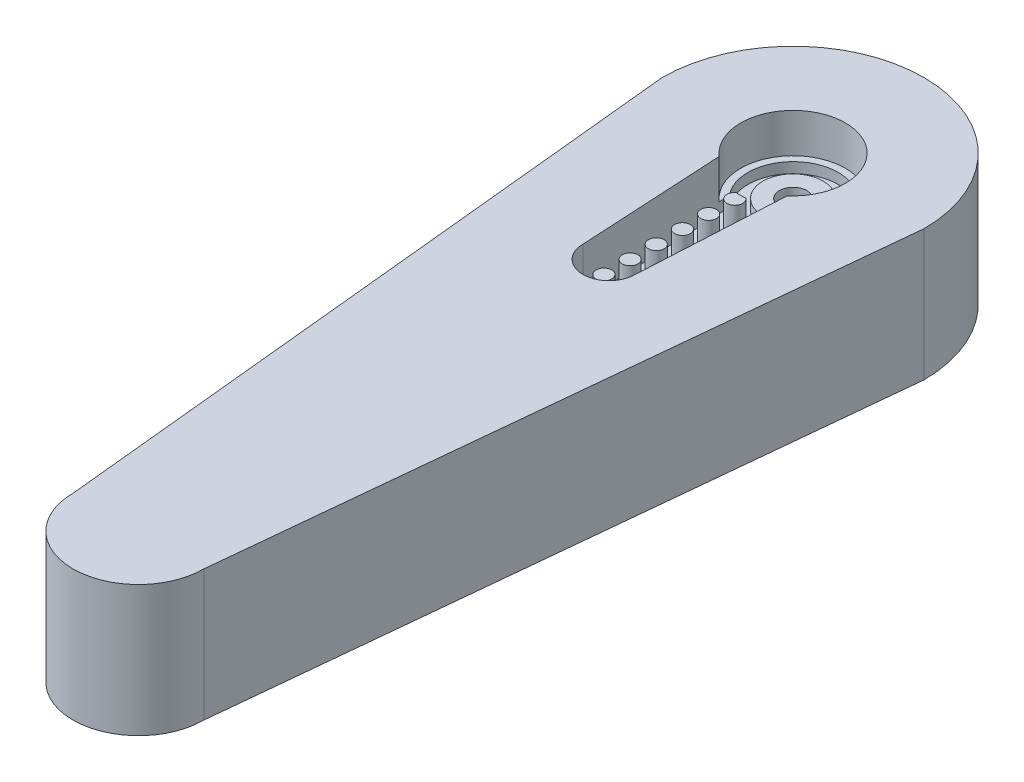
ISO-10303-21;
HEADER;
FILE_DESCRIPTION(('STEP AP214'),'2;1');
FILE_NAME('part.step','',(''),(''),'','','');
FILE_SCHEMA(('AUTOMOTIVE_DESIGN { 1 0 10303 214 1 1 1 1 }'));
ENDSEC;
DATA;
#1=APPLICATION_CONTEXT('core data for automotive mechanical design processes');
#2=APPLICATION_PROTOCOL_DEFINITION('international standard','automotive_design',2000,#1);
#3=PRODUCT_CONTEXT('',#1,'mechanical');
#4=PRODUCT('Part','Part','',(#3));
#5=PRODUCT_RELATED_PRODUCT_CATEGORY('part','',(#4));
#6=PRODUCT_DEFINITION_FORMATION('','',#4);
#7=PRODUCT_DEFINITION_CONTEXT('part definition',#1,'design');
#8=PRODUCT_DEFINITION('design','',#6,#7);
#9=PRODUCT_DEFINITION_SHAPE('','',#8);
#10=(LENGTH_UNIT() NAMED_UNIT(*) SI_UNIT(.MILLI.,.METRE.));
#11=(NAMED_UNIT(*) PLANE_ANGLE_UNIT() SI_UNIT($,.RADIAN.));
#12=(NAMED_UNIT(*) SI_UNIT($,.STERADIAN.) SOLID_ANGLE_UNIT());
#13=UNCERTAINTY_MEASURE_WITH_UNIT(LENGTH_MEASURE(1.E-05),#10,'distance_accuracy_value','');
#14=(GEOMETRIC_REPRESENTATION_CONTEXT(3) GLOBAL_UNCERTAINTY_ASSIGNED_CONTEXT((#13)) GLOBAL_UNIT_ASSIGNED_CONTEXT((#10,
#11,#12)) REPRESENTATION_CONTEXT('',''));
#15=CARTESIAN_POINT('',(0.,0.,0.));
#16=DIRECTION('',(0.,0.,1.));
#17=DIRECTION('',(1.,0.,0.));
#18=AXIS2_PLACEMENT_3D('',#15,#16,#17);
#19=CARTESIAN_POINT('',(0.,0.,0.));
#20=DIRECTION('',(0.,1.,0.));
#21=DIRECTION('',(0.,0.,1.));
#22=AXIS2_PLACEMENT_3D('',#19,#20,#21);
#23=CYLINDRICAL_SURFACE('',#22,1.05);
#24=CARTESIAN_POINT('',(0.,6.,0.));
#25=DIRECTION('',(0.,-1.,0.));
#26=DIRECTION('',(0.,0.,-1.));
#27=AXIS2_PLACEMENT_3D('',#24,#25,#26);
#28=CIRCLE('',#27,1.05);
#29=CARTESIAN_POINT('',(0.,6.,-1.05));
#30=VERTEX_POINT('',#29);
#31=EDGE_CURVE('E210',#30,#30,#28,.F.);
#32=ORIENTED_EDGE('',*,*,#31,.F.);
#33=EDGE_LOOP('',(#32));
#34=FACE_BOUND('',#33,.T.);
#35=CARTESIAN_POINT('',(0.,7.,0.));
#36=DIRECTION('',(0.,1.,0.));
#37=DIRECTION('',(0.,0.,1.));
#38=AXIS2_PLACEMENT_3D('',#35,#36,#37);
#39=CIRCLE('',#38,1.05);
#40=CARTESIAN_POINT('',(0.,7.,1.05));
#41=VERTEX_POINT('',#40);
#42=EDGE_CURVE('E201',#41,#41,#39,.F.);
#43=ORIENTED_EDGE('',*,*,#42,.F.);
#44=EDGE_LOOP('',(#43));
#45=FACE_BOUND('',#44,.T.);
#46=ADVANCED_FACE('F43',(#34,#45),#23,.F.);
#47=CARTESIAN_POINT('',(0.,6.2,0.));
#48=DIRECTION('',(0.,1.,0.));
#49=DIRECTION('',(0.,0.,1.));
#50=AXIS2_PLACEMENT_3D('',#47,#48,#49);
#51=CYLINDRICAL_SURFACE('',#50,3.45);
#52=CARTESIAN_POINT('',(0.,7.,0.));
#53=DIRECTION('',(0.,1.,0.));
#54=DIRECTION('',(0.,0.,1.));
#55=AXIS2_PLACEMENT_3D('',#52,#53,#54);
#56=CIRCLE('',#55,3.45);
#57=CARTESIAN_POINT('',(-2.64922630214937,7.,2.21));
#58=VERTEX_POINT('',#57);
#59=CARTESIAN_POINT('',(2.64922630214937,7.,2.21));
#60=VERTEX_POINT('',#59);
#61=EDGE_CURVE('E59',#58,#60,#56,.F.);
#62=ORIENTED_EDGE('',*,*,#61,.F.);
#63=DIRECTION('',(0.,1.,0.));
#64=VECTOR('',#63,1.);
#65=CARTESIAN_POINT('',(-2.64922630214937,6.2,2.21));
#66=LINE('',#65,#64);
#67=CARTESIAN_POINT('',(-2.64922630214937,6.2,2.21));
#68=VERTEX_POINT('',#67);
#69=EDGE_CURVE('E298',#68,#58,#66,.T.);
#70=ORIENTED_EDGE('',*,*,#69,.F.);
#71=CARTESIAN_POINT('',(0.,6.2,0.));
#72=DIRECTION('',(0.,1.,0.));
#73=DIRECTION('',(0.,0.,1.));
#74=AXIS2_PLACEMENT_3D('',#71,#72,#73);
#75=CIRCLE('',#74,3.45);
#76=CARTESIAN_POINT('',(2.64922630214937,6.2,2.21));
#77=VERTEX_POINT('',#76);
#78=EDGE_CURVE('E276',#77,#68,#75,.T.);
#79=ORIENTED_EDGE('',*,*,#78,.F.);
#80=DIRECTION('',(0.,1.,0.));
#81=VECTOR('',#80,1.);
#82=CARTESIAN_POINT('',(2.64922630214937,6.2,2.21));
#83=LINE('',#82,#81);
#84=EDGE_CURVE('E302',#77,#60,#83,.T.);
#85=ORIENTED_EDGE('',*,*,#84,.T.);
#86=EDGE_LOOP('',(#62,#70,#79,#85));
#87=FACE_BOUND('',#86,.T.);
#88=ADVANCED_FACE('F353',(#87),#51,.F.);
#89=CARTESIAN_POINT('',(0.,7.2,0.));
#90=DIRECTION('',(0.,-1.,0.));
#91=DIRECTION('',(0.,0.,-1.));
#92=AXIS2_PLACEMENT_3D('',#89,#90,#91);
#93=CYLINDRICAL_SURFACE('',#92,2.3);
#94=CARTESIAN_POINT('',(0.,6.2,0.));
#95=DIRECTION('',(0.,1.,0.));
#96=DIRECTION('',(0.,0.,1.));
#97=AXIS2_PLACEMENT_3D('',#94,#95,#96);
#98=CIRCLE('',#97,2.3);
#99=CARTESIAN_POINT('',(0.,6.2,2.3));
#100=VERTEX_POINT('',#99);
#101=EDGE_CURVE('E259',#100,#100,#98,.T.);
#102=ORIENTED_EDGE('',*,*,#101,.T.);
#103=EDGE_LOOP('',(#102));
#104=FACE_BOUND('',#103,.T.);
#105=CARTESIAN_POINT('',(0.,7.,0.));
#106=DIRECTION('',(0.,1.,0.));
#107=DIRECTION('',(0.,0.,1.));
#108=AXIS2_PLACEMENT_3D('',#105,#106,#107);
#109=CIRCLE('',#108,2.3);
#110=CARTESIAN_POINT('',(0.,7.,2.3));
#111=VERTEX_POINT('',#110);
#112=EDGE_CURVE('E189',#111,#111,#109,.T.);
#113=ORIENTED_EDGE('',*,*,#112,.F.);
#114=EDGE_LOOP('',(#113));
#115=FACE_BOUND('',#114,.T.);
#116=ADVANCED_FACE('F360',(#104,#115),#93,.T.);
#117=CARTESIAN_POINT('',(9.9009900990099,10.,0.990099009900989));
#118=DIRECTION('',(0.995037190209989,0.,0.0995037190209988));
#119=DIRECTION('',(0.0995037190209988,0.,-0.995037190209989));
#120=AXIS2_PLACEMENT_3D('',#117,#118,#119);
#121=PLANE('',#120);
#122=DIRECTION('',(-0.0995037190209988,0.,0.995037190209989));
#123=VECTOR('',#122,1.);
#124=CARTESIAN_POINT('',(9.9009900990099,0.,0.990099009900989));
#125=LINE('',#124,#123);
#126=CARTESIAN_POINT('',(10.,0.,0.));
#127=VERTEX_POINT('',#126);
#128=CARTESIAN_POINT('',(5.,0.,50.));
#129=VERTEX_POINT('',#128);
#130=EDGE_CURVE('E297',#127,#129,#125,.T.);
#131=ORIENTED_EDGE('',*,*,#130,.F.);
#132=DIRECTION('',(0.,-1.,0.));
#133=VECTOR('',#132,1.);
#134=CARTESIAN_POINT('',(10.,10.,0.));
#135=LINE('',#134,#133);
#136=CARTESIAN_POINT('',(10.,10.,0.));
#137=VERTEX_POINT('',#136);
#138=EDGE_CURVE('E326',#137,#127,#135,.T.);
#139=ORIENTED_EDGE('',*,*,#138,.F.);
#140=DIRECTION('',(-0.0995037190209988,0.,0.995037190209989));
#141=VECTOR('',#140,1.);
#142=CARTESIAN_POINT('',(9.9009900990099,10.,0.990099009900989));
#143=LINE('',#142,#141);
#144=CARTESIAN_POINT('',(5.,10.,50.));
#145=VERTEX_POINT('',#144);
#146=EDGE_CURVE('E309',#137,#145,#143,.T.);
#147=ORIENTED_EDGE('',*,*,#146,.T.);
#148=DIRECTION('',(0.,-1.,0.));
#149=VECTOR('',#148,1.);
#150=CARTESIAN_POINT('',(5.,10.,50.));
#151=LINE('',#150,#149);
#152=EDGE_CURVE('E146',#145,#129,#151,.T.);
#153=ORIENTED_EDGE('',*,*,#152,.T.);
#154=EDGE_LOOP('',(#131,#139,#147,#153));
#155=FACE_BOUND('',#154,.T.);
#156=ADVANCED_FACE('F45',(#155),#121,.T.);
#157=CARTESIAN_POINT('',(0.,10.,0.));
#158=DIRECTION('',(0.,-1.,0.));
#159=DIRECTION('',(0.,0.,-1.));
#160=AXIS2_PLACEMENT_3D('',#157,#158,#159);
#161=CYLINDRICAL_SURFACE('',#160,10.);
#162=CARTESIAN_POINT('',(0.,0.,0.));
#163=DIRECTION('',(0.,1.,0.));
#164=DIRECTION('',(0.,0.,1.));
#165=AXIS2_PLACEMENT_3D('',#162,#163,#164);
#166=CIRCLE('',#165,10.);
#167=CARTESIAN_POINT('',(-10.,0.,0.));
#168=VERTEX_POINT('',#167);
#169=EDGE_CURVE('E317',#127,#168,#166,.T.);
#170=ORIENTED_EDGE('',*,*,#169,.T.);
#171=DIRECTION('',(0.,-1.,0.));
#172=VECTOR('',#171,1.);
#173=CARTESIAN_POINT('',(-10.,10.,0.));
#174=LINE('',#173,#172);
#175=CARTESIAN_POINT('',(-10.,10.,0.));
#176=VERTEX_POINT('',#175);
#177=EDGE_CURVE('E145',#176,#168,#174,.T.);
#178=ORIENTED_EDGE('',*,*,#177,.F.);
#179=CARTESIAN_POINT('',(0.,10.,0.));
#180=DIRECTION('',(0.,1.,0.));
#181=DIRECTION('',(0.,0.,1.));
#182=AXIS2_PLACEMENT_3D('',#179,#180,#181);
#183=CIRCLE('',#182,10.);
#184=EDGE_CURVE('E155',#137,#176,#183,.T.);
#185=ORIENTED_EDGE('',*,*,#184,.F.);
#186=ORIENTED_EDGE('',*,*,#138,.T.);
#187=EDGE_LOOP('',(#170,#178,#185,#186));
#188=FACE_BOUND('',#187,.T.);
#189=ADVANCED_FACE('F391',(#188),#161,.T.);
#190=CARTESIAN_POINT('',(-9.9009900990099,10.,0.990099009900981));
#191=DIRECTION('',(0.995037190209989,0.,-0.099503719020998));
#192=DIRECTION('',(-0.099503719020998,0.,-0.995037190209989));
#193=AXIS2_PLACEMENT_3D('',#190,#191,#192);
#194=PLANE('',#193);
#195=DIRECTION('',(0.099503719020998,0.,0.995037190209989));
#196=VECTOR('',#195,1.);
#197=CARTESIAN_POINT('',(-9.9009900990099,0.,0.990099009900981));
#198=LINE('',#197,#196);
#199=CARTESIAN_POINT('',(-5.00000000000005,0.,50.));
#200=VERTEX_POINT('',#199);
#201=EDGE_CURVE('E139',#168,#200,#198,.T.);
#202=ORIENTED_EDGE('',*,*,#201,.T.);
#203=DIRECTION('',(0.,-1.,0.));
#204=VECTOR('',#203,1.);
#205=CARTESIAN_POINT('',(-5.00000000000005,10.,50.));
#206=LINE('',#205,#204);
#207=CARTESIAN_POINT('',(-5.00000000000005,10.,50.));
#208=VERTEX_POINT('',#207);
#209=EDGE_CURVE('E133',#208,#200,#206,.T.);
#210=ORIENTED_EDGE('',*,*,#209,.F.);
#211=DIRECTION('',(0.099503719020998,0.,0.995037190209989));
#212=VECTOR('',#211,1.);
#213=CARTESIAN_POINT('',(-9.9009900990099,10.,0.990099009900981));
#214=LINE('',#213,#212);
#215=EDGE_CURVE('E137',#176,#208,#214,.T.);
#216=ORIENTED_EDGE('',*,*,#215,.F.);
#217=ORIENTED_EDGE('',*,*,#177,.T.);
#218=EDGE_LOOP('',(#202,#210,#216,#217));
#219=FACE_BOUND('',#218,.T.);
#220=ADVANCED_FACE('F135',(#219),#194,.F.);
#221=CARTESIAN_POINT('',(0.,10.,0.));
#222=DIRECTION('',(0.,1.,0.));
#223=DIRECTION('',(0.,0.,1.));
#224=AXIS2_PLACEMENT_3D('',#221,#222,#223);
#225=PLANE('',#224);
#226=ORIENTED_EDGE('',*,*,#215,.T.);
#227=CARTESIAN_POINT('',(0.,10.,50.));
#228=DIRECTION('',(0.,1.,0.));
#229=DIRECTION('',(0.,0.,1.));
#230=AXIS2_PLACEMENT_3D('',#227,#228,#229);
#231=CIRCLE('',#230,5.00000000000003);
#232=EDGE_CURVE('E153',#208,#145,#231,.T.);
#233=ORIENTED_EDGE('',*,*,#232,.T.);
#234=ORIENTED_EDGE('',*,*,#146,.F.);
#235=ORIENTED_EDGE('',*,*,#184,.T.);
#236=EDGE_LOOP('',(#226,#233,#234,#235));
#237=FACE_BOUND('',#236,.T.);
#238=CARTESIAN_POINT('',(0.,10.,0.));
#239=DIRECTION('',(0.,1.,0.));
#240=DIRECTION('',(0.,0.,1.));
#241=AXIS2_PLACEMENT_3D('',#238,#239,#240);
#242=CIRCLE('',#241,3.99955369022658);
#243=CARTESIAN_POINT('',(2.60394667886196,10.,3.03576866948864));
#244=VERTEX_POINT('',#243);
#245=CARTESIAN_POINT('',(-2.60394667886196,10.,3.03576866948864));
#246=VERTEX_POINT('',#245);
#247=EDGE_CURVE('E165',#244,#246,#242,.T.);
#248=ORIENTED_EDGE('',*,*,#247,.F.);
#249=DIRECTION('',(0.0547510545701876,0.,-0.998500036065824));
#250=VECTOR('',#249,1.);
#251=CARTESIAN_POINT('',(2.,10.,14.05));
#252=LINE('',#251,#250);
#253=CARTESIAN_POINT('',(2.,10.,14.05));
#254=VERTEX_POINT('',#253);
#255=EDGE_CURVE('E287',#254,#244,#252,.T.);
#256=ORIENTED_EDGE('',*,*,#255,.F.);
#257=CARTESIAN_POINT('',(0.,10.,14.05));
#258=DIRECTION('',(0.,1.,0.));
#259=DIRECTION('',(0.,0.,1.));
#260=AXIS2_PLACEMENT_3D('',#257,#258,#259);
#261=CIRCLE('',#260,2.);
#262=CARTESIAN_POINT('',(-2.,10.,14.05));
#263=VERTEX_POINT('',#262);
#264=EDGE_CURVE('E266',#263,#254,#261,.T.);
#265=ORIENTED_EDGE('',*,*,#264,.F.);
#266=DIRECTION('',(0.054751054570188,0.,0.998500036065824));
#267=VECTOR('',#266,1.);
#268=CARTESIAN_POINT('',(-2.,10.,14.05));
#269=LINE('',#268,#267);
#270=EDGE_CURVE('E272',#246,#263,#269,.T.);
#271=ORIENTED_EDGE('',*,*,#270,.F.);
#272=EDGE_LOOP('',(#248,#256,#265,#271));
#273=FACE_BOUND('',#272,.T.);
#274=ADVANCED_FACE('F150',(#237,#273),#225,.T.);
#275=CARTESIAN_POINT('',(0.,0.,0.));
#276=DIRECTION('',(0.,1.,0.));
#277=DIRECTION('',(0.,0.,1.));
#278=AXIS2_PLACEMENT_3D('',#275,#276,#277);
#279=PLANE('',#278);
#280=CARTESIAN_POINT('',(0.,0.,0.));
#281=DIRECTION('',(0.,-1.,0.));
#282=DIRECTION('',(0.,0.,-1.));
#283=AXIS2_PLACEMENT_3D('',#280,#281,#282);
#284=CIRCLE('',#283,2.);
#285=CARTESIAN_POINT('',(0.,0.,-2.));
#286=VERTEX_POINT('',#285);
#287=EDGE_CURVE('E205',#286,#286,#284,.T.);
#288=ORIENTED_EDGE('',*,*,#287,.F.);
#289=EDGE_LOOP('',(#288));
#290=FACE_BOUND('',#289,.T.);
#291=ORIENTED_EDGE('',*,*,#130,.T.);
#292=CARTESIAN_POINT('',(0.,0.,50.));
#293=DIRECTION('',(0.,1.,0.));
#294=DIRECTION('',(0.,0.,1.));
#295=AXIS2_PLACEMENT_3D('',#292,#293,#294);
#296=CIRCLE('',#295,5.00000000000003);
#297=EDGE_CURVE('E162',#200,#129,#296,.T.);
#298=ORIENTED_EDGE('',*,*,#297,.F.);
#299=ORIENTED_EDGE('',*,*,#201,.F.);
#300=ORIENTED_EDGE('',*,*,#169,.F.);
#301=EDGE_LOOP('',(#291,#298,#299,#300));
#302=FACE_BOUND('',#301,.T.);
#303=ADVANCED_FACE('F383',(#290,#302),#279,.F.);
#304=CARTESIAN_POINT('',(0.,6.2,14.05));
#305=DIRECTION('',(0.,1.,0.));
#306=DIRECTION('',(0.,0.,1.));
#307=AXIS2_PLACEMENT_3D('',#304,#305,#306);
#308=CYLINDRICAL_SURFACE('',#307,2.);
#309=ORIENTED_EDGE('',*,*,#264,.T.);
#310=DIRECTION('',(0.,1.,0.));
#311=VECTOR('',#310,1.);
#312=CARTESIAN_POINT('',(2.,6.2,14.05));
#313=LINE('',#312,#311);
#314=CARTESIAN_POINT('',(2.,6.2,14.05));
#315=VERTEX_POINT('',#314);
#316=EDGE_CURVE('E284',#315,#254,#313,.T.);
#317=ORIENTED_EDGE('',*,*,#316,.F.);
#318=CARTESIAN_POINT('',(0.,6.2,14.05));
#319=DIRECTION('',(0.,1.,0.));
#320=DIRECTION('',(0.,0.,1.));
#321=AXIS2_PLACEMENT_3D('',#318,#319,#320);
#322=CIRCLE('',#321,2.);
#323=CARTESIAN_POINT('',(-2.,6.2,14.05));
#324=VERTEX_POINT('',#323);
#325=EDGE_CURVE('E267',#324,#315,#322,.T.);
#326=ORIENTED_EDGE('',*,*,#325,.F.);
#327=DIRECTION('',(0.,1.,0.));
#328=VECTOR('',#327,1.);
#329=CARTESIAN_POINT('',(-2.,6.2,14.05));
#330=LINE('',#329,#328);
#331=EDGE_CURVE('E293',#324,#263,#330,.T.);
#332=ORIENTED_EDGE('',*,*,#331,.T.);
#333=EDGE_LOOP('',(#309,#317,#326,#332));
#334=FACE_BOUND('',#333,.T.);
#335=ADVANCED_FACE('F375',(#334),#308,.F.);
#336=CARTESIAN_POINT('',(-2.,6.2,14.05));
#337=DIRECTION('',(-0.998500036065824,0.,0.054751054570188));
#338=DIRECTION('',(0.054751054570188,0.,0.998500036065824));
#339=AXIS2_PLACEMENT_3D('',#336,#337,#338);
#340=PLANE('',#339);
#341=DIRECTION('',(-0.054751054570188,0.,-0.998500036065824));
#342=VECTOR('',#341,1.);
#343=CARTESIAN_POINT('',(-2.,7.,14.05));
#344=LINE('',#343,#342);
#345=CARTESIAN_POINT('',(-2.60394667886196,7.,3.03576866948864));
#346=VERTEX_POINT('',#345);
#347=EDGE_CURVE('E198',#346,#58,#344,.T.);
#348=ORIENTED_EDGE('',*,*,#347,.F.);
#349=DIRECTION('',(0.,1.,0.));
#350=VECTOR('',#349,1.);
#351=CARTESIAN_POINT('',(-2.60394667886196,7.,3.03576866948864));
#352=LINE('',#351,#350);
#353=EDGE_CURVE('E185',#346,#246,#352,.T.);
#354=ORIENTED_EDGE('',*,*,#353,.T.);
#355=ORIENTED_EDGE('',*,*,#270,.T.);
#356=ORIENTED_EDGE('',*,*,#331,.F.);
#357=DIRECTION('',(0.054751054570188,0.,0.998500036065824));
#358=VECTOR('',#357,1.);
#359=CARTESIAN_POINT('',(-2.,6.2,14.05));
#360=LINE('',#359,#358);
#361=EDGE_CURVE('E280',#68,#324,#360,.T.);
#362=ORIENTED_EDGE('',*,*,#361,.F.);
#363=ORIENTED_EDGE('',*,*,#69,.T.);
#364=EDGE_LOOP('',(#348,#354,#355,#356,#362,#363));
#365=FACE_BOUND('',#364,.T.);
#366=ADVANCED_FACE('F373',(#365),#340,.F.);
#367=CARTESIAN_POINT('',(2.,6.2,14.05));
#368=DIRECTION('',(0.998500036065824,0.,0.0547510545701876));
#369=DIRECTION('',(0.0547510545701876,0.,-0.998500036065824));
#370=AXIS2_PLACEMENT_3D('',#367,#368,#369);
#371=PLANE('',#370);
#372=ORIENTED_EDGE('',*,*,#255,.T.);
#373=DIRECTION('',(0.,1.,0.));
#374=VECTOR('',#373,1.);
#375=CARTESIAN_POINT('',(2.60394667886196,7.,3.03576866948864));
#376=LINE('',#375,#374);
#377=CARTESIAN_POINT('',(2.60394667886196,7.,3.03576866948864));
#378=VERTEX_POINT('',#377);
#379=EDGE_CURVE('E181',#244,#378,#376,.F.);
#380=ORIENTED_EDGE('',*,*,#379,.T.);
#381=DIRECTION('',(-0.0547510545701876,0.,0.998500036065824));
#382=VECTOR('',#381,1.);
#383=CARTESIAN_POINT('',(2.,7.,14.05));
#384=LINE('',#383,#382);
#385=EDGE_CURVE('E193',#60,#378,#384,.T.);
#386=ORIENTED_EDGE('',*,*,#385,.F.);
#387=ORIENTED_EDGE('',*,*,#84,.F.);
#388=DIRECTION('',(0.0547510545701876,0.,-0.998500036065824));
#389=VECTOR('',#388,1.);
#390=CARTESIAN_POINT('',(2.,6.2,14.05));
#391=LINE('',#390,#389);
#392=EDGE_CURVE('E271',#315,#77,#391,.T.);
#393=ORIENTED_EDGE('',*,*,#392,.F.);
#394=ORIENTED_EDGE('',*,*,#316,.T.);
#395=EDGE_LOOP('',(#372,#380,#386,#387,#393,#394));
#396=FACE_BOUND('',#395,.T.);
#397=ADVANCED_FACE('F371',(#396),#371,.F.);
#398=CARTESIAN_POINT('',(0.,6.2,14.05));
#399=DIRECTION('',(0.,1.,0.));
#400=DIRECTION('',(0.,0.,1.));
#401=AXIS2_PLACEMENT_3D('',#398,#399,#400);
#402=PLANE('',#401);
#403=CARTESIAN_POINT('',(0.,6.2,14.45));
#404=DIRECTION('',(0.,1.,0.));
#405=DIRECTION('',(0.,0.,1.));
#406=AXIS2_PLACEMENT_3D('',#403,#404,#405);
#407=CIRCLE('',#406,0.6);
#408=CARTESIAN_POINT('',(0.,6.2,15.05));
#409=VERTEX_POINT('',#408);
#410=EDGE_CURVE('E219',#409,#409,#407,.T.);
#411=ORIENTED_EDGE('',*,*,#410,.F.);
#412=EDGE_LOOP('',(#411));
#413=FACE_BOUND('',#412,.T.);
#414=CARTESIAN_POINT('',(0.,6.2,12.45));
#415=DIRECTION('',(0.,1.,0.));
#416=DIRECTION('',(0.,0.,1.));
#417=AXIS2_PLACEMENT_3D('',#414,#415,#416);
#418=CIRCLE('',#417,0.6);
#419=CARTESIAN_POINT('',(0.,6.2,13.05));
#420=VERTEX_POINT('',#419);
#421=EDGE_CURVE('E218',#420,#420,#418,.T.);
#422=ORIENTED_EDGE('',*,*,#421,.F.);
#423=EDGE_LOOP('',(#422));
#424=FACE_BOUND('',#423,.T.);
#425=CARTESIAN_POINT('',(0.,6.2,10.45));
#426=DIRECTION('',(0.,1.,0.));
#427=DIRECTION('',(0.,0.,1.));
#428=AXIS2_PLACEMENT_3D('',#425,#426,#427);
#429=CIRCLE('',#428,0.6);
#430=CARTESIAN_POINT('',(0.,6.2,11.05));
#431=VERTEX_POINT('',#430);
#432=EDGE_CURVE('E227',#431,#431,#429,.T.);
#433=ORIENTED_EDGE('',*,*,#432,.F.);
#434=EDGE_LOOP('',(#433));
#435=FACE_BOUND('',#434,.T.);
#436=CARTESIAN_POINT('',(0.,6.2,8.45));
#437=DIRECTION('',(0.,1.,0.));
#438=DIRECTION('',(0.,0.,1.));
#439=AXIS2_PLACEMENT_3D('',#436,#437,#438);
#440=CIRCLE('',#439,0.6);
#441=CARTESIAN_POINT('',(0.,6.2,9.05));
#442=VERTEX_POINT('',#441);
#443=EDGE_CURVE('E235',#442,#442,#440,.T.);
#444=ORIENTED_EDGE('',*,*,#443,.F.);
#445=EDGE_LOOP('',(#444));
#446=FACE_BOUND('',#445,.T.);
#447=CARTESIAN_POINT('',(0.,6.2,6.45));
#448=DIRECTION('',(0.,1.,0.));
#449=DIRECTION('',(0.,0.,1.));
#450=AXIS2_PLACEMENT_3D('',#447,#448,#449);
#451=CIRCLE('',#450,0.6);
#452=CARTESIAN_POINT('',(0.,6.2,7.05));
#453=VERTEX_POINT('',#452);
#454=EDGE_CURVE('E243',#453,#453,#451,.T.);
#455=ORIENTED_EDGE('',*,*,#454,.F.);
#456=EDGE_LOOP('',(#455));
#457=FACE_BOUND('',#456,.T.);
#458=CARTESIAN_POINT('',(0.,6.2,4.45));
#459=DIRECTION('',(0.,1.,0.));
#460=DIRECTION('',(0.,0.,1.));
#461=AXIS2_PLACEMENT_3D('',#458,#459,#460);
#462=CIRCLE('',#461,0.6);
#463=CARTESIAN_POINT('',(0.,6.2,5.05));
#464=VERTEX_POINT('',#463);
#465=EDGE_CURVE('E251',#464,#464,#462,.T.);
#466=ORIENTED_EDGE('',*,*,#465,.F.);
#467=EDGE_LOOP('',(#466));
#468=FACE_BOUND('',#467,.T.);
#469=ORIENTED_EDGE('',*,*,#101,.F.);
#470=EDGE_LOOP('',(#469));
#471=FACE_BOUND('',#470,.T.);
#472=ORIENTED_EDGE('',*,*,#325,.T.);
#473=ORIENTED_EDGE('',*,*,#392,.T.);
#474=ORIENTED_EDGE('',*,*,#78,.T.);
#475=ORIENTED_EDGE('',*,*,#361,.T.);
#476=EDGE_LOOP('',(#472,#473,#474,#475));
#477=FACE_BOUND('',#476,.T.);
#478=ADVANCED_FACE('F350',(#413,#424,#435,#446,#457,#468,#471,#477),#402,.T.);
#479=CARTESIAN_POINT('',(0.,9.2,4.45));
#480=DIRECTION('',(0.,-1.,0.));
#481=DIRECTION('',(0.,0.,-1.));
#482=AXIS2_PLACEMENT_3D('',#479,#480,#481);
#483=CYLINDRICAL_SURFACE('',#482,0.6);
#484=CARTESIAN_POINT('',(0.,7.,4.45));
#485=DIRECTION('',(0.,1.,0.));
#486=DIRECTION('',(0.,0.,1.));
#487=AXIS2_PLACEMENT_3D('',#484,#485,#486);
#488=CIRCLE('',#487,0.6);
#489=CARTESIAN_POINT('',(0.375345793192827,7.,3.98190221584327));
#490=VERTEX_POINT('',#489);
#491=CARTESIAN_POINT('',(-0.375345793192826,7.,3.98190221584327));
#492=VERTEX_POINT('',#491);
#493=EDGE_CURVE('E11',#490,#492,#488,.T.);
#494=ORIENTED_EDGE('',*,*,#493,.F.);
#495=DIRECTION('',(0.,1.,0.));
#496=VECTOR('',#495,1.);
#497=CARTESIAN_POINT('',(0.375345793192831,8.5,3.98190221584326));
#498=LINE('',#497,#496);
#499=CARTESIAN_POINT('',(0.375345793192831,9.2,3.98190221584327));
#500=VERTEX_POINT('',#499);
#501=EDGE_CURVE('E177',#490,#500,#498,.T.);
#502=ORIENTED_EDGE('',*,*,#501,.T.);
#503=CARTESIAN_POINT('',(0.,9.2,4.45));
#504=DIRECTION('',(0.,1.,0.));
#505=DIRECTION('',(0.,0.,1.));
#506=AXIS2_PLACEMENT_3D('',#503,#504,#505);
#507=CIRCLE('',#506,0.6);
#508=CARTESIAN_POINT('',(-0.37534579319283,9.2,3.98190221584327));
#509=VERTEX_POINT('',#508);
#510=EDGE_CURVE('E255',#509,#500,#507,.T.);
#511=ORIENTED_EDGE('',*,*,#510,.F.);
#512=DIRECTION('',(0.,1.,0.));
#513=VECTOR('',#512,1.);
#514=CARTESIAN_POINT('',(-0.37534579319283,8.5,3.98190221584326));
#515=LINE('',#514,#513);
#516=EDGE_CURVE('E67',#509,#492,#515,.F.);
#517=ORIENTED_EDGE('',*,*,#516,.T.);
#518=EDGE_LOOP('',(#494,#502,#511,#517));
#519=FACE_BOUND('',#518,.T.);
#520=ORIENTED_EDGE('',*,*,#465,.T.);
#521=EDGE_LOOP('',(#520));
#522=FACE_BOUND('',#521,.T.);
#523=ADVANCED_FACE('F337',(#519,#522),#483,.T.);
#524=CARTESIAN_POINT('',(0.,9.2,4.45));
#525=DIRECTION('',(0.,1.,0.));
#526=DIRECTION('',(0.,0.,1.));
#527=AXIS2_PLACEMENT_3D('',#524,#525,#526);
#528=PLANE('',#527);
#529=CARTESIAN_POINT('',(0.,9.2,0.));
#530=DIRECTION('',(0.,1.,0.));
#531=DIRECTION('',(0.,0.,1.));
#532=AXIS2_PLACEMENT_3D('',#529,#530,#531);
#533=CIRCLE('',#532,3.99955369022658);
#534=EDGE_CURVE('E52',#509,#500,#533,.T.);
#535=ORIENTED_EDGE('',*,*,#534,.F.);
#536=ORIENTED_EDGE('',*,*,#510,.T.);
#537=EDGE_LOOP('',(#535,#536));
#538=FACE_BOUND('',#537,.T.);
#539=ADVANCED_FACE('F339',(#538),#528,.T.);
#540=CARTESIAN_POINT('',(0.,9.2,6.45));
#541=DIRECTION('',(0.,-1.,0.));
#542=DIRECTION('',(0.,0.,-1.));
#543=AXIS2_PLACEMENT_3D('',#540,#541,#542);
#544=CYLINDRICAL_SURFACE('',#543,0.6);
#545=CARTESIAN_POINT('',(0.,9.2,6.45));
#546=DIRECTION('',(0.,1.,0.));
#547=DIRECTION('',(0.,0.,1.));
#548=AXIS2_PLACEMENT_3D('',#545,#546,#547);
#549=CIRCLE('',#548,0.6);
#550=CARTESIAN_POINT('',(0.,9.2,7.05));
#551=VERTEX_POINT('',#550);
#552=EDGE_CURVE('E247',#551,#551,#549,.T.);
#553=ORIENTED_EDGE('',*,*,#552,.F.);
#554=EDGE_LOOP('',(#553));
#555=FACE_BOUND('',#554,.T.);
#556=ORIENTED_EDGE('',*,*,#454,.T.);
#557=EDGE_LOOP('',(#556));
#558=FACE_BOUND('',#557,.T.);
#559=ADVANCED_FACE('F341',(#555,#558),#544,.T.);
#560=CARTESIAN_POINT('',(0.,9.2,6.45));
#561=DIRECTION('',(0.,1.,0.));
#562=DIRECTION('',(0.,0.,1.));
#563=AXIS2_PLACEMENT_3D('',#560,#561,#562);
#564=PLANE('',#563);
#565=ORIENTED_EDGE('',*,*,#552,.T.);
#566=EDGE_LOOP('',(#565));
#567=FACE_BOUND('',#566,.T.);
#568=ADVANCED_FACE('F347',(#567),#564,.T.);
#569=CARTESIAN_POINT('',(0.,9.2,8.45));
#570=DIRECTION('',(0.,-1.,0.));
#571=DIRECTION('',(0.,0.,-1.));
#572=AXIS2_PLACEMENT_3D('',#569,#570,#571);
#573=CYLINDRICAL_SURFACE('',#572,0.6);
#574=CARTESIAN_POINT('',(0.,9.2,8.45));
#575=DIRECTION('',(0.,1.,0.));
#576=DIRECTION('',(0.,0.,1.));
#577=AXIS2_PLACEMENT_3D('',#574,#575,#576);
#578=CIRCLE('',#577,0.6);
#579=CARTESIAN_POINT('',(0.,9.2,9.05));
#580=VERTEX_POINT('',#579);
#581=EDGE_CURVE('E239',#580,#580,#578,.T.);
#582=ORIENTED_EDGE('',*,*,#581,.F.);
#583=EDGE_LOOP('',(#582));
#584=FACE_BOUND('',#583,.T.);
#585=ORIENTED_EDGE('',*,*,#443,.T.);
#586=EDGE_LOOP('',(#585));
#587=FACE_BOUND('',#586,.T.);
#588=ADVANCED_FACE('F533',(#584,#587),#573,.T.);
#589=CARTESIAN_POINT('',(0.,9.2,8.45));
#590=DIRECTION('',(0.,1.,0.));
#591=DIRECTION('',(0.,0.,1.));
#592=AXIS2_PLACEMENT_3D('',#589,#590,#591);
#593=PLANE('',#592);
#594=ORIENTED_EDGE('',*,*,#581,.T.);
#595=EDGE_LOOP('',(#594));
#596=FACE_BOUND('',#595,.T.);
#597=ADVANCED_FACE('F525',(#596),#593,.T.);
#598=CARTESIAN_POINT('',(0.,9.2,10.45));
#599=DIRECTION('',(0.,-1.,0.));
#600=DIRECTION('',(0.,0.,-1.));
#601=AXIS2_PLACEMENT_3D('',#598,#599,#600);
#602=CYLINDRICAL_SURFACE('',#601,0.6);
#603=CARTESIAN_POINT('',(0.,9.2,10.45));
#604=DIRECTION('',(0.,1.,0.));
#605=DIRECTION('',(0.,0.,1.));
#606=AXIS2_PLACEMENT_3D('',#603,#604,#605);
#607=CIRCLE('',#606,0.6);
#608=CARTESIAN_POINT('',(0.,9.2,11.05));
#609=VERTEX_POINT('',#608);
#610=EDGE_CURVE('E231',#609,#609,#607,.T.);
#611=ORIENTED_EDGE('',*,*,#610,.F.);
#612=EDGE_LOOP('',(#611));
#613=FACE_BOUND('',#612,.T.);
#614=ORIENTED_EDGE('',*,*,#432,.T.);
#615=EDGE_LOOP('',(#614));
#616=FACE_BOUND('',#615,.T.);
#617=ADVANCED_FACE('F517',(#613,#616),#602,.T.);
#618=CARTESIAN_POINT('',(0.,9.2,10.45));
#619=DIRECTION('',(0.,1.,0.));
#620=DIRECTION('',(0.,0.,1.));
#621=AXIS2_PLACEMENT_3D('',#618,#619,#620);
#622=PLANE('',#621);
#623=ORIENTED_EDGE('',*,*,#610,.T.);
#624=EDGE_LOOP('',(#623));
#625=FACE_BOUND('',#624,.T.);
#626=ADVANCED_FACE('F509',(#625),#622,.T.);
#627=CARTESIAN_POINT('',(0.,9.2,12.45));
#628=DIRECTION('',(0.,-1.,0.));
#629=DIRECTION('',(0.,0.,-1.));
#630=AXIS2_PLACEMENT_3D('',#627,#628,#629);
#631=CYLINDRICAL_SURFACE('',#630,0.6);
#632=CARTESIAN_POINT('',(0.,9.2,12.45));
#633=DIRECTION('',(0.,1.,0.));
#634=DIRECTION('',(0.,0.,1.));
#635=AXIS2_PLACEMENT_3D('',#632,#633,#634);
#636=CIRCLE('',#635,0.6);
#637=CARTESIAN_POINT('',(0.,9.2,13.05));
#638=VERTEX_POINT('',#637);
#639=EDGE_CURVE('E223',#638,#638,#636,.T.);
#640=ORIENTED_EDGE('',*,*,#639,.F.);
#641=EDGE_LOOP('',(#640));
#642=FACE_BOUND('',#641,.T.);
#643=ORIENTED_EDGE('',*,*,#421,.T.);
#644=EDGE_LOOP('',(#643));
#645=FACE_BOUND('',#644,.T.);
#646=ADVANCED_FACE('F501',(#642,#645),#631,.T.);
#647=CARTESIAN_POINT('',(0.,9.2,12.45));
#648=DIRECTION('',(0.,1.,0.));
#649=DIRECTION('',(0.,0.,1.));
#650=AXIS2_PLACEMENT_3D('',#647,#648,#649);
#651=PLANE('',#650);
#652=ORIENTED_EDGE('',*,*,#639,.T.);
#653=EDGE_LOOP('',(#652));
#654=FACE_BOUND('',#653,.T.);
#655=ADVANCED_FACE('F493',(#654),#651,.T.);
#656=CARTESIAN_POINT('',(0.,9.2,14.45));
#657=DIRECTION('',(0.,-1.,0.));
#658=DIRECTION('',(0.,0.,-1.));
#659=AXIS2_PLACEMENT_3D('',#656,#657,#658);
#660=CYLINDRICAL_SURFACE('',#659,0.6);
#661=CARTESIAN_POINT('',(0.,9.2,14.45));
#662=DIRECTION('',(0.,1.,0.));
#663=DIRECTION('',(0.,0.,1.));
#664=AXIS2_PLACEMENT_3D('',#661,#662,#663);
#665=CIRCLE('',#664,0.6);
#666=CARTESIAN_POINT('',(0.,9.2,15.05));
#667=VERTEX_POINT('',#666);
#668=EDGE_CURVE('E214',#667,#667,#665,.T.);
#669=ORIENTED_EDGE('',*,*,#668,.F.);
#670=EDGE_LOOP('',(#669));
#671=FACE_BOUND('',#670,.T.);
#672=ORIENTED_EDGE('',*,*,#410,.T.);
#673=EDGE_LOOP('',(#672));
#674=FACE_BOUND('',#673,.T.);
#675=ADVANCED_FACE('F485',(#671,#674),#660,.T.);
#676=CARTESIAN_POINT('',(0.,9.2,14.45));
#677=DIRECTION('',(0.,1.,0.));
#678=DIRECTION('',(0.,0.,1.));
#679=AXIS2_PLACEMENT_3D('',#676,#677,#678);
#680=PLANE('',#679);
#681=ORIENTED_EDGE('',*,*,#668,.T.);
#682=EDGE_LOOP('',(#681));
#683=FACE_BOUND('',#682,.T.);
#684=ADVANCED_FACE('F477',(#683),#680,.T.);
#685=CARTESIAN_POINT('',(0.,6.,0.));
#686=DIRECTION('',(0.,-1.,0.));
#687=DIRECTION('',(0.,0.,-1.));
#688=AXIS2_PLACEMENT_3D('',#685,#686,#687);
#689=PLANE('',#688);
#690=CARTESIAN_POINT('',(0.,6.,0.));
#691=DIRECTION('',(0.,-1.,0.));
#692=DIRECTION('',(0.,0.,-1.));
#693=AXIS2_PLACEMENT_3D('',#690,#691,#692);
#694=CIRCLE('',#693,2.);
#695=CARTESIAN_POINT('',(0.,6.,-2.));
#696=VERTEX_POINT('',#695);
#697=EDGE_CURVE('E206',#696,#696,#694,.T.);
#698=ORIENTED_EDGE('',*,*,#697,.T.);
#699=EDGE_LOOP('',(#698));
#700=FACE_BOUND('',#699,.T.);
#701=ORIENTED_EDGE('',*,*,#31,.T.);
#702=EDGE_LOOP('',(#701));
#703=FACE_BOUND('',#702,.T.);
#704=ADVANCED_FACE('F469',(#700,#703),#689,.T.);
#705=CARTESIAN_POINT('',(0.,6.,0.));
#706=DIRECTION('',(0.,-1.,0.));
#707=DIRECTION('',(0.,0.,-1.));
#708=AXIS2_PLACEMENT_3D('',#705,#706,#707);
#709=CYLINDRICAL_SURFACE('',#708,2.);
#710=ORIENTED_EDGE('',*,*,#697,.F.);
#711=EDGE_LOOP('',(#710));
#712=FACE_BOUND('',#711,.T.);
#713=ORIENTED_EDGE('',*,*,#287,.T.);
#714=EDGE_LOOP('',(#713));
#715=FACE_BOUND('',#714,.T.);
#716=ADVANCED_FACE('F463',(#712,#715),#709,.F.);
#717=CARTESIAN_POINT('',(0.,7.,0.));
#718=DIRECTION('',(0.,1.,0.));
#719=DIRECTION('',(0.,0.,1.));
#720=AXIS2_PLACEMENT_3D('',#717,#718,#719);
#721=CYLINDRICAL_SURFACE('',#720,3.99955369022658);
#722=CARTESIAN_POINT('',(0.,7.,0.));
#723=DIRECTION('',(0.,1.,0.));
#724=DIRECTION('',(0.,0.,1.));
#725=AXIS2_PLACEMENT_3D('',#722,#723,#724);
#726=CIRCLE('',#725,3.99955369022658);
#727=EDGE_CURVE('E168',#492,#490,#726,.T.);
#728=ORIENTED_EDGE('',*,*,#727,.F.);
#729=ORIENTED_EDGE('',*,*,#516,.F.);
#730=ORIENTED_EDGE('',*,*,#534,.T.);
#731=ORIENTED_EDGE('',*,*,#501,.F.);
#732=EDGE_LOOP('',(#728,#729,#730,#731));
#733=FACE_BOUND('',#732,.T.);
#734=ADVANCED_FACE('F332',(#733),#721,.F.);
#735=CARTESIAN_POINT('',(0.,7.,0.));
#736=DIRECTION('',(0.,1.,0.));
#737=DIRECTION('',(0.,0.,1.));
#738=AXIS2_PLACEMENT_3D('',#735,#736,#737);
#739=PLANE('',#738);
#740=ORIENTED_EDGE('',*,*,#493,.T.);
#741=ORIENTED_EDGE('',*,*,#727,.T.);
#742=EDGE_LOOP('',(#740,#741));
#743=FACE_BOUND('',#742,.T.);
#744=ADVANCED_FACE('F445',(#743),#739,.T.);
#745=ORIENTED_EDGE('',*,*,#112,.T.);
#746=EDGE_LOOP('',(#745));
#747=FACE_BOUND('',#746,.T.);
#748=ORIENTED_EDGE('',*,*,#42,.T.);
#749=EDGE_LOOP('',(#748));
#750=FACE_BOUND('',#749,.T.);
#751=ADVANCED_FACE('F443',(#747,#750),#739,.T.);
#752=ORIENTED_EDGE('',*,*,#347,.T.);
#753=ORIENTED_EDGE('',*,*,#61,.T.);
#754=ORIENTED_EDGE('',*,*,#385,.T.);
#755=EDGE_CURVE('E172',#378,#346,#726,.T.);
#756=ORIENTED_EDGE('',*,*,#755,.T.);
#757=EDGE_LOOP('',(#752,#753,#754,#756));
#758=FACE_BOUND('',#757,.T.);
#759=ADVANCED_FACE('F438',(#758),#739,.T.);
#760=ORIENTED_EDGE('',*,*,#755,.F.);
#761=ORIENTED_EDGE('',*,*,#379,.F.);
#762=ORIENTED_EDGE('',*,*,#247,.T.);
#763=ORIENTED_EDGE('',*,*,#353,.F.);
#764=EDGE_LOOP('',(#760,#761,#762,#763));
#765=FACE_BOUND('',#764,.T.);
#766=ADVANCED_FACE('F406',(#765),#721,.F.);
#767=CARTESIAN_POINT('',(0.,0.,50.));
#768=DIRECTION('',(0.,1.,0.));
#769=DIRECTION('',(0.,0.,1.));
#770=AXIS2_PLACEMENT_3D('',#767,#768,#769);
#771=CYLINDRICAL_SURFACE('',#770,5.00000000000003);
#772=ORIENTED_EDGE('',*,*,#209,.T.);
#773=ORIENTED_EDGE('',*,*,#297,.T.);
#774=ORIENTED_EDGE('',*,*,#152,.F.);
#775=ORIENTED_EDGE('',*,*,#232,.F.);
#776=EDGE_LOOP('',(#772,#773,#774,#775));
#777=FACE_BOUND('',#776,.T.);
#778=ADVANCED_FACE('F160',(#777),#771,.T.);
#779=CLOSED_SHELL('',(#46,#88,#116,#156,#189,#220,#274,#303,#335,#366,#397,#478,#523,#539,#559,
#568,#588,#597,#617,#626,#646,#655,#675,#684,#704,#716,#734,#744,#751,#759,#766,#778));
#780=MANIFOLD_SOLID_BREP('B2',#779);
#781=ADVANCED_BREP_SHAPE_REPRESENTATION('',(#18,#780),#14);
#782=SHAPE_DEFINITION_REPRESENTATION(#9,#781);
ENDSEC;
END-ISO-10303-21;
